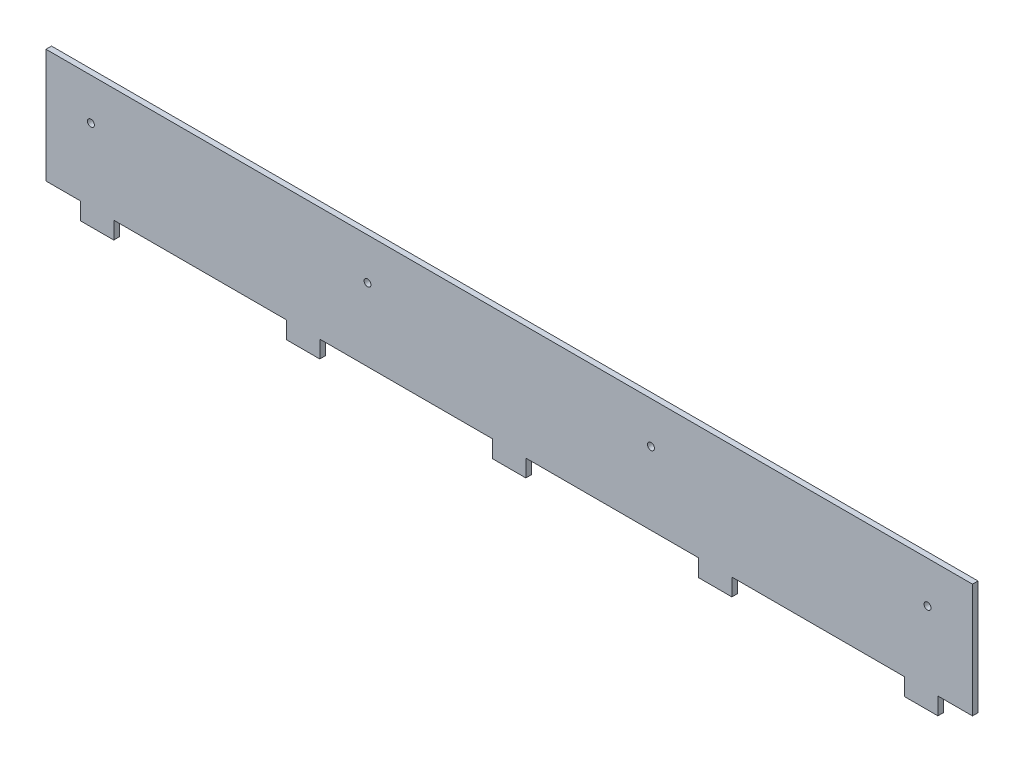
ISO-10303-21;
HEADER;
FILE_DESCRIPTION(('STEP AP214'),'2;1');
FILE_NAME('part.step','',(''),(''),'','','');
FILE_SCHEMA(('AUTOMOTIVE_DESIGN { 1 0 10303 214 1 1 1 1 }'));
ENDSEC;
DATA;
#1=APPLICATION_CONTEXT('core data for automotive mechanical design processes');
#2=APPLICATION_PROTOCOL_DEFINITION('international standard','automotive_design',2000,#1);
#3=PRODUCT_CONTEXT('',#1,'mechanical');
#4=PRODUCT('Part','Part','',(#3));
#5=PRODUCT_RELATED_PRODUCT_CATEGORY('part','',(#4));
#6=PRODUCT_DEFINITION_FORMATION('','',#4);
#7=PRODUCT_DEFINITION_CONTEXT('part definition',#1,'design');
#8=PRODUCT_DEFINITION('design','',#6,#7);
#9=PRODUCT_DEFINITION_SHAPE('','',#8);
#10=(LENGTH_UNIT() NAMED_UNIT(*) SI_UNIT(.MILLI.,.METRE.));
#11=(NAMED_UNIT(*) PLANE_ANGLE_UNIT() SI_UNIT($,.RADIAN.));
#12=(NAMED_UNIT(*) SI_UNIT($,.STERADIAN.) SOLID_ANGLE_UNIT());
#13=UNCERTAINTY_MEASURE_WITH_UNIT(LENGTH_MEASURE(1.E-05),#10,'distance_accuracy_value','');
#14=(GEOMETRIC_REPRESENTATION_CONTEXT(3) GLOBAL_UNCERTAINTY_ASSIGNED_CONTEXT((#13)) GLOBAL_UNIT_ASSIGNED_CONTEXT((#10,
#11,#12)) REPRESENTATION_CONTEXT('',''));
#15=CARTESIAN_POINT('',(0.,0.,0.));
#16=DIRECTION('',(0.,0.,1.));
#17=DIRECTION('',(1.,0.,0.));
#18=AXIS2_PLACEMENT_3D('',#15,#16,#17);
#19=CARTESIAN_POINT('',(-335.,-47.5,2.));
#20=DIRECTION('',(0.,1.,0.));
#21=DIRECTION('',(-1.,0.,0.));
#22=AXIS2_PLACEMENT_3D('',#19,#20,#21);
#23=PLANE('',#22);
#24=DIRECTION('',(1.,0.,0.));
#25=VECTOR('',#24,1.);
#26=CARTESIAN_POINT('',(-335.,-47.5,-2.));
#27=LINE('',#26,#25);
#28=CARTESIAN_POINT('',(-12.,-47.5,-2.));
#29=VERTEX_POINT('',#28);
#30=CARTESIAN_POINT('',(12.,-47.5,-2.));
#31=VERTEX_POINT('',#30);
#32=EDGE_CURVE('E220',#29,#31,#27,.T.);
#33=ORIENTED_EDGE('',*,*,#32,.T.);
#34=DIRECTION('',(0.,0.,1.));
#35=VECTOR('',#34,1.);
#36=CARTESIAN_POINT('',(12.,-47.5,-2.));
#37=LINE('',#36,#35);
#38=CARTESIAN_POINT('',(12.,-47.5,2.));
#39=VERTEX_POINT('',#38);
#40=EDGE_CURVE('E245',#31,#39,#37,.T.);
#41=ORIENTED_EDGE('',*,*,#40,.T.);
#42=DIRECTION('',(1.,0.,0.));
#43=VECTOR('',#42,1.);
#44=CARTESIAN_POINT('',(-335.,-47.5,2.));
#45=LINE('',#44,#43);
#46=CARTESIAN_POINT('',(-12.,-47.5,2.));
#47=VERTEX_POINT('',#46);
#48=EDGE_CURVE('E726',#47,#39,#45,.T.);
#49=ORIENTED_EDGE('',*,*,#48,.F.);
#50=DIRECTION('',(0.,0.,1.));
#51=VECTOR('',#50,1.);
#52=CARTESIAN_POINT('',(-12.,-47.5,-2.));
#53=LINE('',#52,#51);
#54=EDGE_CURVE('E247',#29,#47,#53,.T.);
#55=ORIENTED_EDGE('',*,*,#54,.F.);
#56=EDGE_LOOP('',(#33,#41,#49,#55));
#57=FACE_BOUND('',#56,.T.);
#58=ADVANCED_FACE('F34',(#57),#23,.F.);
#59=CARTESIAN_POINT('',(137.,-47.5,2.));
#60=VERTEX_POINT('',#59);
#61=CARTESIAN_POINT('',(161.,-47.5,2.));
#62=VERTEX_POINT('',#61);
#63=EDGE_CURVE('E376',#60,#62,#45,.T.);
#64=ORIENTED_EDGE('',*,*,#63,.F.);
#65=DIRECTION('',(0.,0.,1.));
#66=VECTOR('',#65,1.);
#67=CARTESIAN_POINT('',(137.,-47.5,-2.));
#68=LINE('',#67,#66);
#69=CARTESIAN_POINT('',(137.,-47.5,-2.));
#70=VERTEX_POINT('',#69);
#71=EDGE_CURVE('E276',#70,#60,#68,.T.);
#72=ORIENTED_EDGE('',*,*,#71,.F.);
#73=CARTESIAN_POINT('',(161.,-47.5,-2.));
#74=VERTEX_POINT('',#73);
#75=EDGE_CURVE('E215',#70,#74,#27,.T.);
#76=ORIENTED_EDGE('',*,*,#75,.T.);
#77=DIRECTION('',(0.,0.,1.));
#78=VECTOR('',#77,1.);
#79=CARTESIAN_POINT('',(161.,-47.5,-2.));
#80=LINE('',#79,#78);
#81=EDGE_CURVE('E350',#74,#62,#80,.T.);
#82=ORIENTED_EDGE('',*,*,#81,.T.);
#83=EDGE_LOOP('',(#64,#72,#76,#82));
#84=FACE_BOUND('',#83,.T.);
#85=ADVANCED_FACE('F462',(#84),#23,.F.);
#86=CARTESIAN_POINT('',(-161.,-47.5,-2.));
#87=VERTEX_POINT('',#86);
#88=CARTESIAN_POINT('',(-137.,-47.5,-2.));
#89=VERTEX_POINT('',#88);
#90=EDGE_CURVE('E227',#87,#89,#27,.T.);
#91=ORIENTED_EDGE('',*,*,#90,.T.);
#92=DIRECTION('',(0.,0.,1.));
#93=VECTOR('',#92,1.);
#94=CARTESIAN_POINT('',(-137.,-47.5,-2.));
#95=LINE('',#94,#93);
#96=CARTESIAN_POINT('',(-137.,-47.5,2.));
#97=VERTEX_POINT('',#96);
#98=EDGE_CURVE('E327',#89,#97,#95,.T.);
#99=ORIENTED_EDGE('',*,*,#98,.T.);
#100=CARTESIAN_POINT('',(-161.,-47.5,2.));
#101=VERTEX_POINT('',#100);
#102=EDGE_CURVE('E728',#101,#97,#45,.T.);
#103=ORIENTED_EDGE('',*,*,#102,.F.);
#104=DIRECTION('',(0.,0.,1.));
#105=VECTOR('',#104,1.);
#106=CARTESIAN_POINT('',(-161.,-47.5,-2.));
#107=LINE('',#106,#105);
#108=EDGE_CURVE('E317',#87,#101,#107,.T.);
#109=ORIENTED_EDGE('',*,*,#108,.F.);
#110=EDGE_LOOP('',(#91,#99,#103,#109));
#111=FACE_BOUND('',#110,.T.);
#112=ADVANCED_FACE('F467',(#111),#23,.F.);
#113=CARTESIAN_POINT('',(-310.,-47.5,-2.));
#114=VERTEX_POINT('',#113);
#115=CARTESIAN_POINT('',(-286.,-47.5,-2.));
#116=VERTEX_POINT('',#115);
#117=EDGE_CURVE('E218',#114,#116,#27,.T.);
#118=ORIENTED_EDGE('',*,*,#117,.T.);
#119=DIRECTION('',(0.,0.,1.));
#120=VECTOR('',#119,1.);
#121=CARTESIAN_POINT('',(-286.,-47.5,-2.));
#122=LINE('',#121,#120);
#123=CARTESIAN_POINT('',(-286.,-47.5,2.));
#124=VERTEX_POINT('',#123);
#125=EDGE_CURVE('E305',#116,#124,#122,.T.);
#126=ORIENTED_EDGE('',*,*,#125,.T.);
#127=CARTESIAN_POINT('',(-310.,-47.5,2.));
#128=VERTEX_POINT('',#127);
#129=EDGE_CURVE('E377',#128,#124,#45,.T.);
#130=ORIENTED_EDGE('',*,*,#129,.F.);
#131=DIRECTION('',(0.,0.,1.));
#132=VECTOR('',#131,1.);
#133=CARTESIAN_POINT('',(-310.,-47.5,-2.));
#134=LINE('',#133,#132);
#135=EDGE_CURVE('E286',#114,#128,#134,.T.);
#136=ORIENTED_EDGE('',*,*,#135,.F.);
#137=EDGE_LOOP('',(#118,#126,#130,#136));
#138=FACE_BOUND('',#137,.T.);
#139=ADVANCED_FACE('F472',(#138),#23,.F.);
#140=CARTESIAN_POINT('',(335.,-47.4999999999999,2.));
#141=DIRECTION('',(-1.,0.,0.));
#142=DIRECTION('',(0.,0.,1.));
#143=AXIS2_PLACEMENT_3D('',#140,#141,#142);
#144=PLANE('',#143);
#145=DIRECTION('',(0.,1.,0.));
#146=VECTOR('',#145,1.);
#147=CARTESIAN_POINT('',(335.,-47.4999999999999,2.));
#148=LINE('',#147,#146);
#149=CARTESIAN_POINT('',(335.,-35.0456021616488,2.));
#150=VERTEX_POINT('',#149);
#151=CARTESIAN_POINT('',(335.,47.4999999999999,2.));
#152=VERTEX_POINT('',#151);
#153=EDGE_CURVE('E226',#150,#152,#148,.T.);
#154=ORIENTED_EDGE('',*,*,#153,.F.);
#155=DIRECTION('',(0.,0.,-1.));
#156=VECTOR('',#155,1.);
#157=CARTESIAN_POINT('',(335.,-35.0456021616488,2.));
#158=LINE('',#157,#156);
#159=CARTESIAN_POINT('',(335.,-35.0456021616488,-2.));
#160=VERTEX_POINT('',#159);
#161=EDGE_CURVE('E366',#150,#160,#158,.T.);
#162=ORIENTED_EDGE('',*,*,#161,.T.);
#163=DIRECTION('',(0.,1.,0.));
#164=VECTOR('',#163,1.);
#165=CARTESIAN_POINT('',(335.,-47.4999999999999,-2.));
#166=LINE('',#165,#164);
#167=CARTESIAN_POINT('',(335.,47.4999999999999,-2.));
#168=VERTEX_POINT('',#167);
#169=EDGE_CURVE('E368',#160,#168,#166,.T.);
#170=ORIENTED_EDGE('',*,*,#169,.T.);
#171=DIRECTION('',(0.,0.,-1.));
#172=VECTOR('',#171,1.);
#173=CARTESIAN_POINT('',(335.,47.4999999999999,2.));
#174=LINE('',#173,#172);
#175=EDGE_CURVE('E42',#152,#168,#174,.T.);
#176=ORIENTED_EDGE('',*,*,#175,.F.);
#177=EDGE_LOOP('',(#154,#162,#170,#176));
#178=FACE_BOUND('',#177,.T.);
#179=ADVANCED_FACE('F36',(#178),#144,.F.);
#180=CARTESIAN_POINT('',(-335.,47.4999999999998,2.));
#181=DIRECTION('',(0.,-1.,0.));
#182=DIRECTION('',(1.,0.,0.));
#183=AXIS2_PLACEMENT_3D('',#180,#181,#182);
#184=PLANE('',#183);
#185=DIRECTION('',(-1.,0.,0.));
#186=VECTOR('',#185,1.);
#187=CARTESIAN_POINT('',(-335.,47.4999999999998,-2.));
#188=LINE('',#187,#186);
#189=CARTESIAN_POINT('',(-335.,47.4999999999998,-2.));
#190=VERTEX_POINT('',#189);
#191=EDGE_CURVE('E222',#168,#190,#188,.T.);
#192=ORIENTED_EDGE('',*,*,#191,.T.);
#193=DIRECTION('',(0.,0.,-1.));
#194=VECTOR('',#193,1.);
#195=CARTESIAN_POINT('',(-335.,47.4999999999998,2.));
#196=LINE('',#195,#194);
#197=CARTESIAN_POINT('',(-335.,47.4999999999998,2.));
#198=VERTEX_POINT('',#197);
#199=EDGE_CURVE('E386',#198,#190,#196,.T.);
#200=ORIENTED_EDGE('',*,*,#199,.F.);
#201=DIRECTION('',(-1.,0.,0.));
#202=VECTOR('',#201,1.);
#203=CARTESIAN_POINT('',(-335.,47.4999999999998,2.));
#204=LINE('',#203,#202);
#205=EDGE_CURVE('E232',#152,#198,#204,.T.);
#206=ORIENTED_EDGE('',*,*,#205,.F.);
#207=ORIENTED_EDGE('',*,*,#175,.T.);
#208=EDGE_LOOP('',(#192,#200,#206,#207));
#209=FACE_BOUND('',#208,.T.);
#210=ADVANCED_FACE('F384',(#209),#184,.F.);
#211=CARTESIAN_POINT('',(-335.,-47.5,2.));
#212=DIRECTION('',(1.,0.,0.));
#213=DIRECTION('',(0.,0.,-1.));
#214=AXIS2_PLACEMENT_3D('',#211,#212,#213);
#215=PLANE('',#214);
#216=DIRECTION('',(0.,-1.,0.));
#217=VECTOR('',#216,1.);
#218=CARTESIAN_POINT('',(-335.,-47.5,-2.));
#219=LINE('',#218,#217);
#220=CARTESIAN_POINT('',(-335.,-35.0456021616492,-2.));
#221=VERTEX_POINT('',#220);
#222=EDGE_CURVE('E216',#190,#221,#219,.T.);
#223=ORIENTED_EDGE('',*,*,#222,.T.);
#224=DIRECTION('',(0.,0.,1.));
#225=VECTOR('',#224,1.);
#226=CARTESIAN_POINT('',(-335.,-35.0456021616492,2.));
#227=LINE('',#226,#225);
#228=CARTESIAN_POINT('',(-335.,-35.0456021616492,2.));
#229=VERTEX_POINT('',#228);
#230=EDGE_CURVE('E363',#221,#229,#227,.T.);
#231=ORIENTED_EDGE('',*,*,#230,.T.);
#232=DIRECTION('',(0.,-1.,0.));
#233=VECTOR('',#232,1.);
#234=CARTESIAN_POINT('',(-335.,-47.5,2.));
#235=LINE('',#234,#233);
#236=EDGE_CURVE('E371',#198,#229,#235,.T.);
#237=ORIENTED_EDGE('',*,*,#236,.F.);
#238=ORIENTED_EDGE('',*,*,#199,.T.);
#239=EDGE_LOOP('',(#223,#231,#237,#238));
#240=FACE_BOUND('',#239,.T.);
#241=ADVANCED_FACE('F391',(#240),#215,.F.);
#242=CARTESIAN_POINT('',(286.,-47.5,-2.));
#243=VERTEX_POINT('',#242);
#244=CARTESIAN_POINT('',(310.,-47.5,-2.));
#245=VERTEX_POINT('',#244);
#246=EDGE_CURVE('E208',#243,#245,#27,.T.);
#247=ORIENTED_EDGE('',*,*,#246,.T.);
#248=DIRECTION('',(0.,0.,1.));
#249=VECTOR('',#248,1.);
#250=CARTESIAN_POINT('',(310.,-47.5,-2.));
#251=LINE('',#250,#249);
#252=CARTESIAN_POINT('',(310.,-47.5,2.));
#253=VERTEX_POINT('',#252);
#254=EDGE_CURVE('E193',#245,#253,#251,.T.);
#255=ORIENTED_EDGE('',*,*,#254,.T.);
#256=CARTESIAN_POINT('',(286.,-47.5,2.));
#257=VERTEX_POINT('',#256);
#258=EDGE_CURVE('E374',#257,#253,#45,.T.);
#259=ORIENTED_EDGE('',*,*,#258,.F.);
#260=DIRECTION('',(0.,0.,1.));
#261=VECTOR('',#260,1.);
#262=CARTESIAN_POINT('',(286.,-47.5,-2.));
#263=LINE('',#262,#261);
#264=EDGE_CURVE('E214',#243,#257,#263,.T.);
#265=ORIENTED_EDGE('',*,*,#264,.F.);
#266=EDGE_LOOP('',(#247,#255,#259,#265));
#267=FACE_BOUND('',#266,.T.);
#268=ADVANCED_FACE('F213',(#267),#23,.F.);
#269=CARTESIAN_POINT('',(0.,0.,2.));
#270=DIRECTION('',(0.,0.,-1.));
#271=DIRECTION('',(-1.,0.,0.));
#272=AXIS2_PLACEMENT_3D('',#269,#270,#271);
#273=PLANE('',#272);
#274=CARTESIAN_POINT('',(302.5,17.5,2.));
#275=DIRECTION('',(0.,0.,1.));
#276=DIRECTION('',(1.,0.,0.));
#277=AXIS2_PLACEMENT_3D('',#274,#275,#276);
#278=CIRCLE('',#277,2.50000000000002);
#279=CARTESIAN_POINT('',(305.,17.5,2.));
#280=VERTEX_POINT('',#279);
#281=EDGE_CURVE('E417',#280,#280,#278,.T.);
#282=ORIENTED_EDGE('',*,*,#281,.F.);
#283=EDGE_LOOP('',(#282));
#284=FACE_BOUND('',#283,.T.);
#285=CARTESIAN_POINT('',(-302.5,17.5,2.));
#286=DIRECTION('',(0.,0.,1.));
#287=DIRECTION('',(1.,0.,0.));
#288=AXIS2_PLACEMENT_3D('',#285,#286,#287);
#289=CIRCLE('',#288,2.50000000000002);
#290=CARTESIAN_POINT('',(-300.,17.5,2.));
#291=VERTEX_POINT('',#290);
#292=EDGE_CURVE('E423',#291,#291,#289,.T.);
#293=ORIENTED_EDGE('',*,*,#292,.F.);
#294=EDGE_LOOP('',(#293));
#295=FACE_BOUND('',#294,.T.);
#296=CARTESIAN_POINT('',(102.5,17.5,2.));
#297=DIRECTION('',(0.,0.,1.));
#298=DIRECTION('',(1.,0.,0.));
#299=AXIS2_PLACEMENT_3D('',#296,#297,#298);
#300=CIRCLE('',#299,2.50000000000002);
#301=CARTESIAN_POINT('',(105.,17.5,2.));
#302=VERTEX_POINT('',#301);
#303=EDGE_CURVE('E429',#302,#302,#300,.T.);
#304=ORIENTED_EDGE('',*,*,#303,.F.);
#305=EDGE_LOOP('',(#304));
#306=FACE_BOUND('',#305,.T.);
#307=CARTESIAN_POINT('',(-102.5,17.5,2.));
#308=DIRECTION('',(0.,0.,1.));
#309=DIRECTION('',(1.,0.,0.));
#310=AXIS2_PLACEMENT_3D('',#307,#308,#309);
#311=CIRCLE('',#310,2.50000000000001);
#312=CARTESIAN_POINT('',(-100.,17.5,2.));
#313=VERTEX_POINT('',#312);
#314=EDGE_CURVE('E411',#313,#313,#311,.T.);
#315=ORIENTED_EDGE('',*,*,#314,.F.);
#316=EDGE_LOOP('',(#315));
#317=FACE_BOUND('',#316,.T.);
#318=ORIENTED_EDGE('',*,*,#258,.T.);
#319=DIRECTION('',(0.,-1.,0.));
#320=VECTOR('',#319,1.);
#321=CARTESIAN_POINT('',(310.,-35.0456021616488,2.));
#322=LINE('',#321,#320);
#323=CARTESIAN_POINT('',(310.,-35.0456021616488,2.));
#324=VERTEX_POINT('',#323);
#325=EDGE_CURVE('E196',#324,#253,#322,.T.);
#326=ORIENTED_EDGE('',*,*,#325,.F.);
#327=DIRECTION('',(-1.,0.,0.));
#328=VECTOR('',#327,1.);
#329=CARTESIAN_POINT('',(310.,-35.0456021616488,2.));
#330=LINE('',#329,#328);
#331=EDGE_CURVE('E210',#150,#324,#330,.T.);
#332=ORIENTED_EDGE('',*,*,#331,.F.);
#333=ORIENTED_EDGE('',*,*,#153,.T.);
#334=ORIENTED_EDGE('',*,*,#205,.T.);
#335=ORIENTED_EDGE('',*,*,#236,.T.);
#336=DIRECTION('',(-1.,0.,0.));
#337=VECTOR('',#336,1.);
#338=CARTESIAN_POINT('',(-435.,-35.0456021616493,2.));
#339=LINE('',#338,#337);
#340=CARTESIAN_POINT('',(-310.,-35.0456021616492,2.));
#341=VERTEX_POINT('',#340);
#342=EDGE_CURVE('E283',#341,#229,#339,.T.);
#343=ORIENTED_EDGE('',*,*,#342,.F.);
#344=DIRECTION('',(0.,1.,0.));
#345=VECTOR('',#344,1.);
#346=CARTESIAN_POINT('',(-310.,-35.0456021616492,2.));
#347=LINE('',#346,#345);
#348=EDGE_CURVE('E287',#128,#341,#347,.T.);
#349=ORIENTED_EDGE('',*,*,#348,.F.);
#350=ORIENTED_EDGE('',*,*,#129,.T.);
#351=DIRECTION('',(0.,-1.,0.));
#352=VECTOR('',#351,1.);
#353=CARTESIAN_POINT('',(-286.,-35.0456021616492,2.));
#354=LINE('',#353,#352);
#355=CARTESIAN_POINT('',(-286.,-35.0456021616492,2.));
#356=VERTEX_POINT('',#355);
#357=EDGE_CURVE('E306',#356,#124,#354,.T.);
#358=ORIENTED_EDGE('',*,*,#357,.F.);
#359=DIRECTION('',(-1.,0.,0.));
#360=VECTOR('',#359,1.);
#361=CARTESIAN_POINT('',(-286.,-35.0456021616492,2.));
#362=LINE('',#361,#360);
#363=CARTESIAN_POINT('',(-161.,-35.0456021616491,2.));
#364=VERTEX_POINT('',#363);
#365=EDGE_CURVE('E299',#364,#356,#362,.T.);
#366=ORIENTED_EDGE('',*,*,#365,.F.);
#367=DIRECTION('',(0.,1.,0.));
#368=VECTOR('',#367,1.);
#369=CARTESIAN_POINT('',(-161.,-35.0456021616491,2.));
#370=LINE('',#369,#368);
#371=EDGE_CURVE('E308',#101,#364,#370,.T.);
#372=ORIENTED_EDGE('',*,*,#371,.F.);
#373=ORIENTED_EDGE('',*,*,#102,.T.);
#374=DIRECTION('',(0.,-1.,0.));
#375=VECTOR('',#374,1.);
#376=CARTESIAN_POINT('',(-137.,-35.0456021616491,2.));
#377=LINE('',#376,#375);
#378=CARTESIAN_POINT('',(-137.,-35.0456021616491,2.));
#379=VERTEX_POINT('',#378);
#380=EDGE_CURVE('E328',#379,#97,#377,.T.);
#381=ORIENTED_EDGE('',*,*,#380,.F.);
#382=DIRECTION('',(-1.,0.,0.));
#383=VECTOR('',#382,1.);
#384=CARTESIAN_POINT('',(-137.,-35.0456021616491,2.));
#385=LINE('',#384,#383);
#386=CARTESIAN_POINT('',(-12.,-35.045602161649,2.));
#387=VERTEX_POINT('',#386);
#388=EDGE_CURVE('E323',#387,#379,#385,.T.);
#389=ORIENTED_EDGE('',*,*,#388,.F.);
#390=DIRECTION('',(0.,1.,0.));
#391=VECTOR('',#390,1.);
#392=CARTESIAN_POINT('',(-12.,-35.045602161649,2.));
#393=LINE('',#392,#391);
#394=EDGE_CURVE('E330',#47,#387,#393,.T.);
#395=ORIENTED_EDGE('',*,*,#394,.F.);
#396=ORIENTED_EDGE('',*,*,#48,.T.);
#397=DIRECTION('',(0.,-1.,0.));
#398=VECTOR('',#397,1.);
#399=CARTESIAN_POINT('',(12.,-35.045602161649,2.));
#400=LINE('',#399,#398);
#401=CARTESIAN_POINT('',(12.,-35.045602161649,2.));
#402=VERTEX_POINT('',#401);
#403=EDGE_CURVE('E266',#402,#39,#400,.T.);
#404=ORIENTED_EDGE('',*,*,#403,.F.);
#405=DIRECTION('',(-1.,0.,0.));
#406=VECTOR('',#405,1.);
#407=CARTESIAN_POINT('',(12.,-35.045602161649,2.));
#408=LINE('',#407,#406);
#409=CARTESIAN_POINT('',(137.,-35.0456021616489,2.));
#410=VERTEX_POINT('',#409);
#411=EDGE_CURVE('E257',#410,#402,#408,.T.);
#412=ORIENTED_EDGE('',*,*,#411,.F.);
#413=DIRECTION('',(0.,1.,0.));
#414=VECTOR('',#413,1.);
#415=CARTESIAN_POINT('',(137.,-35.0456021616489,2.));
#416=LINE('',#415,#414);
#417=EDGE_CURVE('E261',#60,#410,#416,.T.);
#418=ORIENTED_EDGE('',*,*,#417,.F.);
#419=ORIENTED_EDGE('',*,*,#63,.T.);
#420=DIRECTION('',(0.,-1.,0.));
#421=VECTOR('',#420,1.);
#422=CARTESIAN_POINT('',(161.,-35.0456021616489,2.));
#423=LINE('',#422,#421);
#424=CARTESIAN_POINT('',(161.,-35.0456021616489,2.));
#425=VERTEX_POINT('',#424);
#426=EDGE_CURVE('E273',#425,#62,#423,.T.);
#427=ORIENTED_EDGE('',*,*,#426,.F.);
#428=DIRECTION('',(-1.,0.,0.));
#429=VECTOR('',#428,1.);
#430=CARTESIAN_POINT('',(161.,-35.0456021616489,2.));
#431=LINE('',#430,#429);
#432=CARTESIAN_POINT('',(286.,-35.0456021616488,2.));
#433=VERTEX_POINT('',#432);
#434=EDGE_CURVE('E345',#433,#425,#431,.T.);
#435=ORIENTED_EDGE('',*,*,#434,.F.);
#436=DIRECTION('',(0.,1.,0.));
#437=VECTOR('',#436,1.);
#438=CARTESIAN_POINT('',(286.,-35.0456021616488,2.));
#439=LINE('',#438,#437);
#440=EDGE_CURVE('E352',#257,#433,#439,.T.);
#441=ORIENTED_EDGE('',*,*,#440,.F.);
#442=EDGE_LOOP('',(#318,#326,#332,#333,#334,#335,#343,#349,#350,#358,#366,#372,#373,#381,#389,
#395,#396,#404,#412,#418,#419,#427,#435,#441));
#443=FACE_BOUND('',#442,.T.);
#444=ADVANCED_FACE('F402',(#284,#295,#306,#317,#443),#273,.F.);
#445=CARTESIAN_POINT('',(0.,0.,-2.));
#446=DIRECTION('',(0.,0.,-1.));
#447=DIRECTION('',(-1.,0.,0.));
#448=AXIS2_PLACEMENT_3D('',#445,#446,#447);
#449=PLANE('',#448);
#450=CARTESIAN_POINT('',(302.5,17.5,-2.));
#451=DIRECTION('',(0.,0.,1.));
#452=DIRECTION('',(1.,0.,0.));
#453=AXIS2_PLACEMENT_3D('',#450,#451,#452);
#454=CIRCLE('',#453,2.50000000000002);
#455=CARTESIAN_POINT('',(305.,17.5,-2.));
#456=VERTEX_POINT('',#455);
#457=EDGE_CURVE('E420',#456,#456,#454,.T.);
#458=ORIENTED_EDGE('',*,*,#457,.T.);
#459=EDGE_LOOP('',(#458));
#460=FACE_BOUND('',#459,.T.);
#461=CARTESIAN_POINT('',(-302.5,17.5,-2.));
#462=DIRECTION('',(0.,0.,1.));
#463=DIRECTION('',(1.,0.,0.));
#464=AXIS2_PLACEMENT_3D('',#461,#462,#463);
#465=CIRCLE('',#464,2.50000000000002);
#466=CARTESIAN_POINT('',(-300.,17.5,-2.));
#467=VERTEX_POINT('',#466);
#468=EDGE_CURVE('E426',#467,#467,#465,.T.);
#469=ORIENTED_EDGE('',*,*,#468,.T.);
#470=EDGE_LOOP('',(#469));
#471=FACE_BOUND('',#470,.T.);
#472=CARTESIAN_POINT('',(102.5,17.5,-2.));
#473=DIRECTION('',(0.,0.,1.));
#474=DIRECTION('',(1.,0.,0.));
#475=AXIS2_PLACEMENT_3D('',#472,#473,#474);
#476=CIRCLE('',#475,2.50000000000002);
#477=CARTESIAN_POINT('',(105.,17.5,-2.));
#478=VERTEX_POINT('',#477);
#479=EDGE_CURVE('E414',#478,#478,#476,.T.);
#480=ORIENTED_EDGE('',*,*,#479,.T.);
#481=EDGE_LOOP('',(#480));
#482=FACE_BOUND('',#481,.T.);
#483=CARTESIAN_POINT('',(-102.5,17.5,-2.));
#484=DIRECTION('',(0.,0.,1.));
#485=DIRECTION('',(1.,0.,0.));
#486=AXIS2_PLACEMENT_3D('',#483,#484,#485);
#487=CIRCLE('',#486,2.50000000000001);
#488=CARTESIAN_POINT('',(-100.,17.5,-2.));
#489=VERTEX_POINT('',#488);
#490=EDGE_CURVE('E268',#489,#489,#487,.T.);
#491=ORIENTED_EDGE('',*,*,#490,.T.);
#492=EDGE_LOOP('',(#491));
#493=FACE_BOUND('',#492,.T.);
#494=DIRECTION('',(0.,-1.,0.));
#495=VECTOR('',#494,1.);
#496=CARTESIAN_POINT('',(310.,-35.0456021616488,-2.));
#497=LINE('',#496,#495);
#498=CARTESIAN_POINT('',(310.,-35.0456021616488,-2.));
#499=VERTEX_POINT('',#498);
#500=EDGE_CURVE('E49',#499,#245,#497,.T.);
#501=ORIENTED_EDGE('',*,*,#500,.T.);
#502=ORIENTED_EDGE('',*,*,#246,.F.);
#503=DIRECTION('',(0.,1.,0.));
#504=VECTOR('',#503,1.);
#505=CARTESIAN_POINT('',(286.,-35.0456021616488,-2.));
#506=LINE('',#505,#504);
#507=CARTESIAN_POINT('',(286.,-35.0456021616488,-2.));
#508=VERTEX_POINT('',#507);
#509=EDGE_CURVE('E344',#243,#508,#506,.T.);
#510=ORIENTED_EDGE('',*,*,#509,.T.);
#511=DIRECTION('',(-1.,0.,0.));
#512=VECTOR('',#511,1.);
#513=CARTESIAN_POINT('',(161.,-35.0456021616489,-2.));
#514=LINE('',#513,#512);
#515=CARTESIAN_POINT('',(161.,-35.0456021616489,-2.));
#516=VERTEX_POINT('',#515);
#517=EDGE_CURVE('E347',#508,#516,#514,.T.);
#518=ORIENTED_EDGE('',*,*,#517,.T.);
#519=DIRECTION('',(0.,-1.,0.));
#520=VECTOR('',#519,1.);
#521=CARTESIAN_POINT('',(161.,-35.0456021616489,-2.));
#522=LINE('',#521,#520);
#523=EDGE_CURVE('E341',#516,#74,#522,.T.);
#524=ORIENTED_EDGE('',*,*,#523,.T.);
#525=ORIENTED_EDGE('',*,*,#75,.F.);
#526=DIRECTION('',(0.,1.,0.));
#527=VECTOR('',#526,1.);
#528=CARTESIAN_POINT('',(137.,-35.0456021616489,-2.));
#529=LINE('',#528,#527);
#530=CARTESIAN_POINT('',(137.,-35.0456021616489,-2.));
#531=VERTEX_POINT('',#530);
#532=EDGE_CURVE('E256',#70,#531,#529,.T.);
#533=ORIENTED_EDGE('',*,*,#532,.T.);
#534=DIRECTION('',(-1.,0.,0.));
#535=VECTOR('',#534,1.);
#536=CARTESIAN_POINT('',(12.,-35.045602161649,-2.));
#537=LINE('',#536,#535);
#538=CARTESIAN_POINT('',(12.,-35.045602161649,-2.));
#539=VERTEX_POINT('',#538);
#540=EDGE_CURVE('E57',#531,#539,#537,.T.);
#541=ORIENTED_EDGE('',*,*,#540,.T.);
#542=DIRECTION('',(0.,-1.,0.));
#543=VECTOR('',#542,1.);
#544=CARTESIAN_POINT('',(12.,-35.045602161649,-2.));
#545=LINE('',#544,#543);
#546=EDGE_CURVE('E253',#539,#31,#545,.T.);
#547=ORIENTED_EDGE('',*,*,#546,.T.);
#548=ORIENTED_EDGE('',*,*,#32,.F.);
#549=DIRECTION('',(0.,1.,0.));
#550=VECTOR('',#549,1.);
#551=CARTESIAN_POINT('',(-12.,-35.045602161649,-2.));
#552=LINE('',#551,#550);
#553=CARTESIAN_POINT('',(-12.,-35.045602161649,-2.));
#554=VERTEX_POINT('',#553);
#555=EDGE_CURVE('E251',#29,#554,#552,.T.);
#556=ORIENTED_EDGE('',*,*,#555,.T.);
#557=DIRECTION('',(-1.,0.,0.));
#558=VECTOR('',#557,1.);
#559=CARTESIAN_POINT('',(-137.,-35.0456021616491,-2.));
#560=LINE('',#559,#558);
#561=CARTESIAN_POINT('',(-137.,-35.0456021616491,-2.));
#562=VERTEX_POINT('',#561);
#563=EDGE_CURVE('E325',#554,#562,#560,.T.);
#564=ORIENTED_EDGE('',*,*,#563,.T.);
#565=DIRECTION('',(0.,-1.,0.));
#566=VECTOR('',#565,1.);
#567=CARTESIAN_POINT('',(-137.,-35.0456021616491,-2.));
#568=LINE('',#567,#566);
#569=EDGE_CURVE('E320',#562,#89,#568,.T.);
#570=ORIENTED_EDGE('',*,*,#569,.T.);
#571=ORIENTED_EDGE('',*,*,#90,.F.);
#572=DIRECTION('',(0.,1.,0.));
#573=VECTOR('',#572,1.);
#574=CARTESIAN_POINT('',(-161.,-35.0456021616491,-2.));
#575=LINE('',#574,#573);
#576=CARTESIAN_POINT('',(-161.,-35.0456021616491,-2.));
#577=VERTEX_POINT('',#576);
#578=EDGE_CURVE('E298',#87,#577,#575,.T.);
#579=ORIENTED_EDGE('',*,*,#578,.T.);
#580=DIRECTION('',(-1.,0.,0.));
#581=VECTOR('',#580,1.);
#582=CARTESIAN_POINT('',(-286.,-35.0456021616492,-2.));
#583=LINE('',#582,#581);
#584=CARTESIAN_POINT('',(-286.,-35.0456021616492,-2.));
#585=VERTEX_POINT('',#584);
#586=EDGE_CURVE('E302',#577,#585,#583,.T.);
#587=ORIENTED_EDGE('',*,*,#586,.T.);
#588=DIRECTION('',(0.,-1.,0.));
#589=VECTOR('',#588,1.);
#590=CARTESIAN_POINT('',(-286.,-35.0456021616492,-2.));
#591=LINE('',#590,#589);
#592=EDGE_CURVE('E295',#585,#116,#591,.T.);
#593=ORIENTED_EDGE('',*,*,#592,.T.);
#594=ORIENTED_EDGE('',*,*,#117,.F.);
#595=DIRECTION('',(0.,1.,0.));
#596=VECTOR('',#595,1.);
#597=CARTESIAN_POINT('',(-310.,-35.0456021616492,-2.));
#598=LINE('',#597,#596);
#599=CARTESIAN_POINT('',(-310.,-35.0456021616492,-2.));
#600=VERTEX_POINT('',#599);
#601=EDGE_CURVE('E279',#114,#600,#598,.T.);
#602=ORIENTED_EDGE('',*,*,#601,.T.);
#603=DIRECTION('',(-1.,0.,0.));
#604=VECTOR('',#603,1.);
#605=CARTESIAN_POINT('',(-435.,-35.0456021616493,-2.));
#606=LINE('',#605,#604);
#607=EDGE_CURVE('E282',#600,#221,#606,.T.);
#608=ORIENTED_EDGE('',*,*,#607,.T.);
#609=ORIENTED_EDGE('',*,*,#222,.F.);
#610=ORIENTED_EDGE('',*,*,#191,.F.);
#611=ORIENTED_EDGE('',*,*,#169,.F.);
#612=DIRECTION('',(1.,0.,0.));
#613=VECTOR('',#612,1.);
#614=CARTESIAN_POINT('',(0.,-35.045602161649,-2.));
#615=LINE('',#614,#613);
#616=EDGE_CURVE('E11',#499,#160,#615,.T.);
#617=ORIENTED_EDGE('',*,*,#616,.F.);
#618=EDGE_LOOP('',(#501,#502,#510,#518,#524,#525,#533,#541,#547,#548,#556,#564,#570,#571,#579,
#587,#593,#594,#602,#608,#609,#610,#611,#617));
#619=FACE_BOUND('',#618,.T.);
#620=ADVANCED_FACE('F206',(#460,#471,#482,#493,#619),#449,.T.);
#621=CARTESIAN_POINT('',(-435.,-35.0456021616493,-2.));
#622=DIRECTION('',(0.,1.,0.));
#623=DIRECTION('',(-1.,0.,0.));
#624=AXIS2_PLACEMENT_3D('',#621,#622,#623);
#625=PLANE('',#624);
#626=ORIENTED_EDGE('',*,*,#607,.F.);
#627=DIRECTION('',(0.,0.,1.));
#628=VECTOR('',#627,1.);
#629=CARTESIAN_POINT('',(-310.,-35.0456021616492,-2.));
#630=LINE('',#629,#628);
#631=EDGE_CURVE('E292',#600,#341,#630,.T.);
#632=ORIENTED_EDGE('',*,*,#631,.T.);
#633=ORIENTED_EDGE('',*,*,#342,.T.);
#634=ORIENTED_EDGE('',*,*,#230,.F.);
#635=EDGE_LOOP('',(#626,#632,#633,#634));
#636=FACE_BOUND('',#635,.T.);
#637=ADVANCED_FACE('F394',(#636),#625,.F.);
#638=CARTESIAN_POINT('',(-310.,-35.0456021616492,-2.));
#639=DIRECTION('',(1.,0.,0.));
#640=DIRECTION('',(0.,0.,-1.));
#641=AXIS2_PLACEMENT_3D('',#638,#639,#640);
#642=PLANE('',#641);
#643=ORIENTED_EDGE('',*,*,#348,.T.);
#644=ORIENTED_EDGE('',*,*,#631,.F.);
#645=ORIENTED_EDGE('',*,*,#601,.F.);
#646=ORIENTED_EDGE('',*,*,#135,.T.);
#647=EDGE_LOOP('',(#643,#644,#645,#646));
#648=FACE_BOUND('',#647,.T.);
#649=ADVANCED_FACE('F396',(#648),#642,.F.);
#650=CARTESIAN_POINT('',(-286.,-35.0456021616492,-2.));
#651=DIRECTION('',(-1.,0.,0.));
#652=DIRECTION('',(0.,0.,1.));
#653=AXIS2_PLACEMENT_3D('',#650,#651,#652);
#654=PLANE('',#653);
#655=ORIENTED_EDGE('',*,*,#357,.T.);
#656=ORIENTED_EDGE('',*,*,#125,.F.);
#657=ORIENTED_EDGE('',*,*,#592,.F.);
#658=DIRECTION('',(0.,0.,1.));
#659=VECTOR('',#658,1.);
#660=CARTESIAN_POINT('',(-286.,-35.0456021616492,-2.));
#661=LINE('',#660,#659);
#662=EDGE_CURVE('E290',#585,#356,#661,.T.);
#663=ORIENTED_EDGE('',*,*,#662,.T.);
#664=EDGE_LOOP('',(#655,#656,#657,#663));
#665=FACE_BOUND('',#664,.T.);
#666=ADVANCED_FACE('F531',(#665),#654,.F.);
#667=CARTESIAN_POINT('',(-286.,-35.0456021616492,-2.));
#668=DIRECTION('',(0.,1.,0.));
#669=DIRECTION('',(-1.,0.,0.));
#670=AXIS2_PLACEMENT_3D('',#667,#668,#669);
#671=PLANE('',#670);
#672=ORIENTED_EDGE('',*,*,#365,.T.);
#673=ORIENTED_EDGE('',*,*,#662,.F.);
#674=ORIENTED_EDGE('',*,*,#586,.F.);
#675=DIRECTION('',(0.,0.,1.));
#676=VECTOR('',#675,1.);
#677=CARTESIAN_POINT('',(-161.,-35.0456021616491,-2.));
#678=LINE('',#677,#676);
#679=EDGE_CURVE('E315',#577,#364,#678,.T.);
#680=ORIENTED_EDGE('',*,*,#679,.T.);
#681=EDGE_LOOP('',(#672,#673,#674,#680));
#682=FACE_BOUND('',#681,.T.);
#683=ADVANCED_FACE('F540',(#682),#671,.F.);
#684=CARTESIAN_POINT('',(-161.,-35.0456021616491,-2.));
#685=DIRECTION('',(1.,0.,0.));
#686=DIRECTION('',(0.,0.,-1.));
#687=AXIS2_PLACEMENT_3D('',#684,#685,#686);
#688=PLANE('',#687);
#689=ORIENTED_EDGE('',*,*,#371,.T.);
#690=ORIENTED_EDGE('',*,*,#679,.F.);
#691=ORIENTED_EDGE('',*,*,#578,.F.);
#692=ORIENTED_EDGE('',*,*,#108,.T.);
#693=EDGE_LOOP('',(#689,#690,#691,#692));
#694=FACE_BOUND('',#693,.T.);
#695=ADVANCED_FACE('F550',(#694),#688,.F.);
#696=CARTESIAN_POINT('',(-137.,-35.0456021616491,-2.));
#697=DIRECTION('',(-1.,0.,0.));
#698=DIRECTION('',(0.,0.,1.));
#699=AXIS2_PLACEMENT_3D('',#696,#697,#698);
#700=PLANE('',#699);
#701=ORIENTED_EDGE('',*,*,#380,.T.);
#702=ORIENTED_EDGE('',*,*,#98,.F.);
#703=ORIENTED_EDGE('',*,*,#569,.F.);
#704=DIRECTION('',(0.,0.,1.));
#705=VECTOR('',#704,1.);
#706=CARTESIAN_POINT('',(-137.,-35.0456021616491,-2.));
#707=LINE('',#706,#705);
#708=EDGE_CURVE('E309',#562,#379,#707,.T.);
#709=ORIENTED_EDGE('',*,*,#708,.T.);
#710=EDGE_LOOP('',(#701,#702,#703,#709));
#711=FACE_BOUND('',#710,.T.);
#712=ADVANCED_FACE('F560',(#711),#700,.F.);
#713=CARTESIAN_POINT('',(-137.,-35.0456021616491,-2.));
#714=DIRECTION('',(0.,1.,0.));
#715=DIRECTION('',(-1.,0.,0.));
#716=AXIS2_PLACEMENT_3D('',#713,#714,#715);
#717=PLANE('',#716);
#718=ORIENTED_EDGE('',*,*,#388,.T.);
#719=ORIENTED_EDGE('',*,*,#708,.F.);
#720=ORIENTED_EDGE('',*,*,#563,.F.);
#721=DIRECTION('',(0.,0.,1.));
#722=VECTOR('',#721,1.);
#723=CARTESIAN_POINT('',(-12.,-35.045602161649,-2.));
#724=LINE('',#723,#722);
#725=EDGE_CURVE('E337',#554,#387,#724,.T.);
#726=ORIENTED_EDGE('',*,*,#725,.T.);
#727=EDGE_LOOP('',(#718,#719,#720,#726));
#728=FACE_BOUND('',#727,.T.);
#729=ADVANCED_FACE('F570',(#728),#717,.F.);
#730=CARTESIAN_POINT('',(-12.,-35.045602161649,-2.));
#731=DIRECTION('',(1.,0.,0.));
#732=DIRECTION('',(0.,1.,0.));
#733=AXIS2_PLACEMENT_3D('',#730,#731,#732);
#734=PLANE('',#733);
#735=ORIENTED_EDGE('',*,*,#394,.T.);
#736=ORIENTED_EDGE('',*,*,#725,.F.);
#737=ORIENTED_EDGE('',*,*,#555,.F.);
#738=ORIENTED_EDGE('',*,*,#54,.T.);
#739=EDGE_LOOP('',(#735,#736,#737,#738));
#740=FACE_BOUND('',#739,.T.);
#741=ADVANCED_FACE('F580',(#740),#734,.F.);
#742=CARTESIAN_POINT('',(161.,-35.0456021616489,-2.));
#743=DIRECTION('',(-1.,0.,0.));
#744=DIRECTION('',(0.,0.,1.));
#745=AXIS2_PLACEMENT_3D('',#742,#743,#744);
#746=PLANE('',#745);
#747=ORIENTED_EDGE('',*,*,#426,.T.);
#748=ORIENTED_EDGE('',*,*,#81,.F.);
#749=ORIENTED_EDGE('',*,*,#523,.F.);
#750=DIRECTION('',(0.,0.,1.));
#751=VECTOR('',#750,1.);
#752=CARTESIAN_POINT('',(161.,-35.0456021616489,-2.));
#753=LINE('',#752,#751);
#754=EDGE_CURVE('E331',#516,#425,#753,.T.);
#755=ORIENTED_EDGE('',*,*,#754,.T.);
#756=EDGE_LOOP('',(#747,#748,#749,#755));
#757=FACE_BOUND('',#756,.T.);
#758=ADVANCED_FACE('F590',(#757),#746,.F.);
#759=CARTESIAN_POINT('',(161.,-35.0456021616489,-2.));
#760=DIRECTION('',(0.,1.,0.));
#761=DIRECTION('',(-1.,0.,0.));
#762=AXIS2_PLACEMENT_3D('',#759,#760,#761);
#763=PLANE('',#762);
#764=ORIENTED_EDGE('',*,*,#434,.T.);
#765=ORIENTED_EDGE('',*,*,#754,.F.);
#766=ORIENTED_EDGE('',*,*,#517,.F.);
#767=DIRECTION('',(0.,0.,1.));
#768=VECTOR('',#767,1.);
#769=CARTESIAN_POINT('',(286.,-35.0456021616488,-2.));
#770=LINE('',#769,#768);
#771=EDGE_CURVE('E358',#508,#433,#770,.T.);
#772=ORIENTED_EDGE('',*,*,#771,.T.);
#773=EDGE_LOOP('',(#764,#765,#766,#772));
#774=FACE_BOUND('',#773,.T.);
#775=ADVANCED_FACE('F600',(#774),#763,.F.);
#776=CARTESIAN_POINT('',(286.,-35.0456021616488,-2.));
#777=DIRECTION('',(1.,0.,0.));
#778=DIRECTION('',(0.,0.,-1.));
#779=AXIS2_PLACEMENT_3D('',#776,#777,#778);
#780=PLANE('',#779);
#781=ORIENTED_EDGE('',*,*,#440,.T.);
#782=ORIENTED_EDGE('',*,*,#771,.F.);
#783=ORIENTED_EDGE('',*,*,#509,.F.);
#784=ORIENTED_EDGE('',*,*,#264,.T.);
#785=EDGE_LOOP('',(#781,#782,#783,#784));
#786=FACE_BOUND('',#785,.T.);
#787=ADVANCED_FACE('F610',(#786),#780,.F.);
#788=CARTESIAN_POINT('',(12.,-35.045602161649,-2.));
#789=DIRECTION('',(-1.,0.,0.));
#790=DIRECTION('',(0.,-1.,0.));
#791=AXIS2_PLACEMENT_3D('',#788,#789,#790);
#792=PLANE('',#791);
#793=ORIENTED_EDGE('',*,*,#403,.T.);
#794=ORIENTED_EDGE('',*,*,#40,.F.);
#795=ORIENTED_EDGE('',*,*,#546,.F.);
#796=DIRECTION('',(0.,0.,1.));
#797=VECTOR('',#796,1.);
#798=CARTESIAN_POINT('',(12.,-35.045602161649,-2.));
#799=LINE('',#798,#797);
#800=EDGE_CURVE('E271',#539,#402,#799,.T.);
#801=ORIENTED_EDGE('',*,*,#800,.T.);
#802=EDGE_LOOP('',(#793,#794,#795,#801));
#803=FACE_BOUND('',#802,.T.);
#804=ADVANCED_FACE('F620',(#803),#792,.F.);
#805=CARTESIAN_POINT('',(12.,-35.045602161649,-2.));
#806=DIRECTION('',(0.,1.,0.));
#807=DIRECTION('',(-1.,0.,0.));
#808=AXIS2_PLACEMENT_3D('',#805,#806,#807);
#809=PLANE('',#808);
#810=ORIENTED_EDGE('',*,*,#411,.T.);
#811=ORIENTED_EDGE('',*,*,#800,.F.);
#812=ORIENTED_EDGE('',*,*,#540,.F.);
#813=DIRECTION('',(0.,0.,1.));
#814=VECTOR('',#813,1.);
#815=CARTESIAN_POINT('',(137.,-35.0456021616489,-2.));
#816=LINE('',#815,#814);
#817=EDGE_CURVE('E274',#531,#410,#816,.T.);
#818=ORIENTED_EDGE('',*,*,#817,.T.);
#819=EDGE_LOOP('',(#810,#811,#812,#818));
#820=FACE_BOUND('',#819,.T.);
#821=ADVANCED_FACE('F630',(#820),#809,.F.);
#822=CARTESIAN_POINT('',(137.,-35.0456021616489,-2.));
#823=DIRECTION('',(1.,0.,0.));
#824=DIRECTION('',(0.,0.,-1.));
#825=AXIS2_PLACEMENT_3D('',#822,#823,#824);
#826=PLANE('',#825);
#827=ORIENTED_EDGE('',*,*,#417,.T.);
#828=ORIENTED_EDGE('',*,*,#817,.F.);
#829=ORIENTED_EDGE('',*,*,#532,.F.);
#830=ORIENTED_EDGE('',*,*,#71,.T.);
#831=EDGE_LOOP('',(#827,#828,#829,#830));
#832=FACE_BOUND('',#831,.T.);
#833=ADVANCED_FACE('F639',(#832),#826,.F.);
#834=CARTESIAN_POINT('',(310.,-35.0456021616488,-2.));
#835=DIRECTION('',(0.,1.,0.));
#836=DIRECTION('',(-1.,0.,0.));
#837=AXIS2_PLACEMENT_3D('',#834,#835,#836);
#838=PLANE('',#837);
#839=ORIENTED_EDGE('',*,*,#331,.T.);
#840=DIRECTION('',(0.,0.,1.));
#841=VECTOR('',#840,1.);
#842=CARTESIAN_POINT('',(310.,-35.0456021616488,-2.));
#843=LINE('',#842,#841);
#844=EDGE_CURVE('E201',#499,#324,#843,.T.);
#845=ORIENTED_EDGE('',*,*,#844,.F.);
#846=ORIENTED_EDGE('',*,*,#616,.T.);
#847=ORIENTED_EDGE('',*,*,#161,.F.);
#848=EDGE_LOOP('',(#839,#845,#846,#847));
#849=FACE_BOUND('',#848,.T.);
#850=ADVANCED_FACE('F407',(#849),#838,.F.);
#851=CARTESIAN_POINT('',(310.,-35.0456021616488,-2.));
#852=DIRECTION('',(-1.,0.,0.));
#853=DIRECTION('',(0.,0.,1.));
#854=AXIS2_PLACEMENT_3D('',#851,#852,#853);
#855=PLANE('',#854);
#856=ORIENTED_EDGE('',*,*,#325,.T.);
#857=ORIENTED_EDGE('',*,*,#254,.F.);
#858=ORIENTED_EDGE('',*,*,#500,.F.);
#859=ORIENTED_EDGE('',*,*,#844,.T.);
#860=EDGE_LOOP('',(#856,#857,#858,#859));
#861=FACE_BOUND('',#860,.T.);
#862=ADVANCED_FACE('F194',(#861),#855,.F.);
#863=CARTESIAN_POINT('',(-102.5,17.5,-2.));
#864=DIRECTION('',(0.,0.,1.));
#865=DIRECTION('',(1.,0.,0.));
#866=AXIS2_PLACEMENT_3D('',#863,#864,#865);
#867=CYLINDRICAL_SURFACE('',#866,2.50000000000001);
#868=ORIENTED_EDGE('',*,*,#490,.F.);
#869=EDGE_LOOP('',(#868));
#870=FACE_BOUND('',#869,.T.);
#871=ORIENTED_EDGE('',*,*,#314,.T.);
#872=EDGE_LOOP('',(#871));
#873=FACE_BOUND('',#872,.T.);
#874=ADVANCED_FACE('F441',(#870,#873),#867,.F.);
#875=CARTESIAN_POINT('',(102.5,17.5,-2.));
#876=DIRECTION('',(0.,0.,1.));
#877=DIRECTION('',(1.,0.,0.));
#878=AXIS2_PLACEMENT_3D('',#875,#876,#877);
#879=CYLINDRICAL_SURFACE('',#878,2.50000000000002);
#880=ORIENTED_EDGE('',*,*,#479,.F.);
#881=EDGE_LOOP('',(#880));
#882=FACE_BOUND('',#881,.T.);
#883=ORIENTED_EDGE('',*,*,#303,.T.);
#884=EDGE_LOOP('',(#883));
#885=FACE_BOUND('',#884,.T.);
#886=ADVANCED_FACE('F437',(#882,#885),#879,.F.);
#887=CARTESIAN_POINT('',(-302.5,17.5,-2.));
#888=DIRECTION('',(0.,0.,1.));
#889=DIRECTION('',(1.,0.,0.));
#890=AXIS2_PLACEMENT_3D('',#887,#888,#889);
#891=CYLINDRICAL_SURFACE('',#890,2.50000000000002);
#892=ORIENTED_EDGE('',*,*,#468,.F.);
#893=EDGE_LOOP('',(#892));
#894=FACE_BOUND('',#893,.T.);
#895=ORIENTED_EDGE('',*,*,#292,.T.);
#896=EDGE_LOOP('',(#895));
#897=FACE_BOUND('',#896,.T.);
#898=ADVANCED_FACE('F440',(#894,#897),#891,.F.);
#899=CARTESIAN_POINT('',(302.5,17.5,-2.));
#900=DIRECTION('',(0.,0.,1.));
#901=DIRECTION('',(1.,0.,0.));
#902=AXIS2_PLACEMENT_3D('',#899,#900,#901);
#903=CYLINDRICAL_SURFACE('',#902,2.50000000000002);
#904=ORIENTED_EDGE('',*,*,#457,.F.);
#905=EDGE_LOOP('',(#904));
#906=FACE_BOUND('',#905,.T.);
#907=ORIENTED_EDGE('',*,*,#281,.T.);
#908=EDGE_LOOP('',(#907));
#909=FACE_BOUND('',#908,.T.);
#910=ADVANCED_FACE('F693',(#906,#909),#903,.F.);
#911=CLOSED_SHELL('',(#58,#85,#112,#139,#179,#210,#241,#268,#444,#620,#637,#649,#666,#683,#695,
#712,#729,#741,#758,#775,#787,#804,#821,#833,#850,#862,#874,#886,#898,#910));
#912=MANIFOLD_SOLID_BREP('B2',#911);
#913=ADVANCED_BREP_SHAPE_REPRESENTATION('',(#18,#912),#14);
#914=SHAPE_DEFINITION_REPRESENTATION(#9,#913);
ENDSEC;
END-ISO-10303-21;
